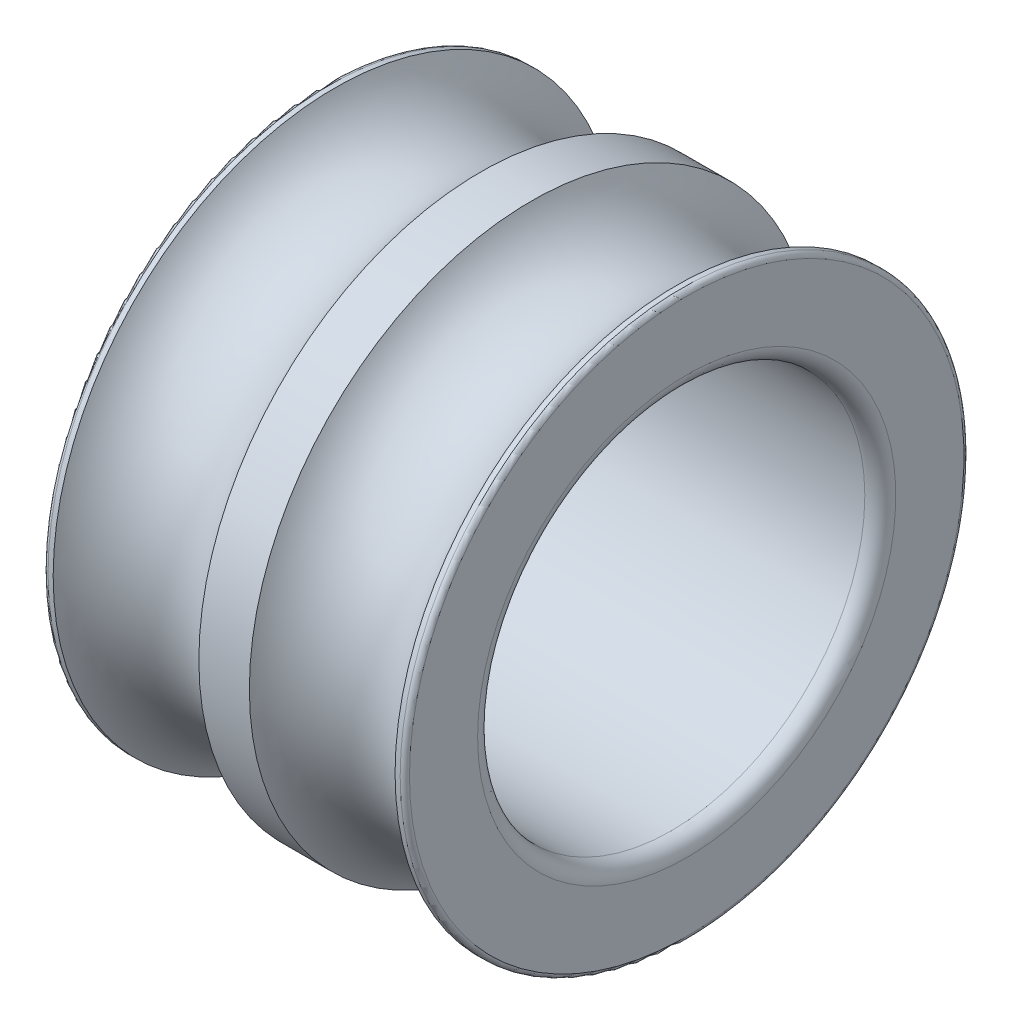
ISO-10303-21;
HEADER;
FILE_DESCRIPTION(('STEP AP214'),'2;1');
FILE_NAME('part.step','',(''),(''),'','','');
FILE_SCHEMA(('AUTOMOTIVE_DESIGN { 1 0 10303 214 1 1 1 1 }'));
ENDSEC;
DATA;
#1=APPLICATION_CONTEXT('core data for automotive mechanical design processes');
#2=APPLICATION_PROTOCOL_DEFINITION('international standard','automotive_design',2000,#1);
#3=PRODUCT_CONTEXT('',#1,'mechanical');
#4=PRODUCT('Part','Part','',(#3));
#5=PRODUCT_RELATED_PRODUCT_CATEGORY('part','',(#4));
#6=PRODUCT_DEFINITION_FORMATION('','',#4);
#7=PRODUCT_DEFINITION_CONTEXT('part definition',#1,'design');
#8=PRODUCT_DEFINITION('design','',#6,#7);
#9=PRODUCT_DEFINITION_SHAPE('','',#8);
#10=(LENGTH_UNIT() NAMED_UNIT(*) SI_UNIT(.MILLI.,.METRE.));
#11=(NAMED_UNIT(*) PLANE_ANGLE_UNIT() SI_UNIT($,.RADIAN.));
#12=(NAMED_UNIT(*) SI_UNIT($,.STERADIAN.) SOLID_ANGLE_UNIT());
#13=UNCERTAINTY_MEASURE_WITH_UNIT(LENGTH_MEASURE(1.E-05),#10,'distance_accuracy_value','');
#14=(GEOMETRIC_REPRESENTATION_CONTEXT(3) GLOBAL_UNCERTAINTY_ASSIGNED_CONTEXT((#13)) GLOBAL_UNIT_ASSIGNED_CONTEXT((#10,
#11,#12)) REPRESENTATION_CONTEXT('',''));
#15=CARTESIAN_POINT('',(0.,0.,0.));
#16=DIRECTION('',(0.,0.,1.));
#17=DIRECTION('',(1.,0.,0.));
#18=AXIS2_PLACEMENT_3D('',#15,#16,#17);
#19=CARTESIAN_POINT('',(0.,0.,0.));
#20=DIRECTION('',(-1.,0.,0.));
#21=DIRECTION('',(0.,0.,1.));
#22=AXIS2_PLACEMENT_3D('',#19,#20,#21);
#23=CYLINDRICAL_SURFACE('',#22,10.92);
#24=CARTESIAN_POINT('',(7.97826387261311,0.,0.));
#25=DIRECTION('',(-1.,0.,0.));
#26=DIRECTION('',(0.,0.,1.));
#27=AXIS2_PLACEMENT_3D('',#24,#25,#26);
#28=CIRCLE('',#27,10.92);
#29=CARTESIAN_POINT('',(7.97826387261311,0.,10.92));
#30=VERTEX_POINT('',#29);
#31=EDGE_CURVE('E71',#30,#30,#28,.T.);
#32=ORIENTED_EDGE('',*,*,#31,.T.);
#33=EDGE_LOOP('',(#32));
#34=FACE_BOUND('',#33,.T.);
#35=CARTESIAN_POINT('',(6.02173612738689,0.,0.));
#36=DIRECTION('',(-1.,0.,0.));
#37=DIRECTION('',(0.,0.,1.));
#38=AXIS2_PLACEMENT_3D('',#35,#36,#37);
#39=CIRCLE('',#38,10.92);
#40=CARTESIAN_POINT('',(6.02173612738689,0.,10.92));
#41=VERTEX_POINT('',#40);
#42=EDGE_CURVE('E10',#41,#41,#39,.T.);
#43=ORIENTED_EDGE('',*,*,#42,.F.);
#44=EDGE_LOOP('',(#43));
#45=FACE_BOUND('',#44,.T.);
#46=ADVANCED_FACE('F14',(#34,#45),#23,.T.);
#47=CARTESIAN_POINT('',(3.2,0.,0.));
#48=DIRECTION('',(-1.,0.,0.));
#49=DIRECTION('',(0.,0.,1.));
#50=AXIS2_PLACEMENT_3D('',#47,#48,#49);
#51=TOROIDAL_SURFACE('',#50,12.4292399502397,3.2);
#52=ORIENTED_EDGE('',*,*,#42,.T.);
#53=EDGE_LOOP('',(#52));
#54=FACE_BOUND('',#53,.T.);
#55=CARTESIAN_POINT('',(0.378263872613112,0.,0.));
#56=DIRECTION('',(-1.,0.,0.));
#57=DIRECTION('',(0.,0.,1.));
#58=AXIS2_PLACEMENT_3D('',#55,#56,#57);
#59=CIRCLE('',#58,10.92);
#60=CARTESIAN_POINT('',(0.378263872613112,0.,10.92));
#61=VERTEX_POINT('',#60);
#62=EDGE_CURVE('E21',#61,#61,#59,.T.);
#63=ORIENTED_EDGE('',*,*,#62,.F.);
#64=EDGE_LOOP('',(#63));
#65=FACE_BOUND('',#64,.T.);
#66=ADVANCED_FACE('F92',(#54,#65),#51,.F.);
#67=CARTESIAN_POINT('',(0.,0.,0.));
#68=DIRECTION('',(-1.,0.,0.));
#69=DIRECTION('',(0.,0.,1.));
#70=AXIS2_PLACEMENT_3D('',#67,#68,#69);
#71=CYLINDRICAL_SURFACE('',#70,10.92);
#72=ORIENTED_EDGE('',*,*,#62,.T.);
#73=EDGE_LOOP('',(#72));
#74=FACE_BOUND('',#73,.T.);
#75=CARTESIAN_POINT('',(0.18,0.,0.));
#76=DIRECTION('',(-1.,0.,0.));
#77=DIRECTION('',(0.,0.,1.));
#78=AXIS2_PLACEMENT_3D('',#75,#76,#77);
#79=CIRCLE('',#78,10.92);
#80=CARTESIAN_POINT('',(0.18,0.,10.92));
#81=VERTEX_POINT('',#80);
#82=EDGE_CURVE('E30',#81,#81,#79,.T.);
#83=ORIENTED_EDGE('',*,*,#82,.F.);
#84=EDGE_LOOP('',(#83));
#85=FACE_BOUND('',#84,.T.);
#86=ADVANCED_FACE('F96',(#74,#85),#71,.T.);
#87=CARTESIAN_POINT('',(0.18,0.,0.));
#88=DIRECTION('',(-1.,0.,0.));
#89=DIRECTION('',(0.,0.,1.));
#90=AXIS2_PLACEMENT_3D('',#87,#88,#89);
#91=TOROIDAL_SURFACE('',#90,10.74,0.18);
#92=CARTESIAN_POINT('',(0.,0.,0.));
#93=DIRECTION('',(-1.,0.,0.));
#94=DIRECTION('',(0.,0.,1.));
#95=AXIS2_PLACEMENT_3D('',#92,#93,#94);
#96=CIRCLE('',#95,10.74);
#97=CARTESIAN_POINT('',(0.,0.,10.74));
#98=VERTEX_POINT('',#97);
#99=EDGE_CURVE('E37',#98,#98,#96,.T.);
#100=ORIENTED_EDGE('',*,*,#99,.F.);
#101=EDGE_LOOP('',(#100));
#102=FACE_BOUND('',#101,.T.);
#103=ORIENTED_EDGE('',*,*,#82,.T.);
#104=EDGE_LOOP('',(#103));
#105=FACE_BOUND('',#104,.T.);
#106=ADVANCED_FACE('F100',(#102,#105),#91,.T.);
#107=CARTESIAN_POINT('',(0.,10.74,0.));
#108=DIRECTION('',(1.,0.,0.));
#109=DIRECTION('',(0.,0.,-1.));
#110=AXIS2_PLACEMENT_3D('',#107,#108,#109);
#111=PLANE('',#110);
#112=CARTESIAN_POINT('',(0.,0.,0.));
#113=DIRECTION('',(-1.,0.,0.));
#114=DIRECTION('',(0.,0.,1.));
#115=AXIS2_PLACEMENT_3D('',#112,#113,#114);
#116=CIRCLE('',#115,8.1);
#117=CARTESIAN_POINT('',(0.,0.,8.1));
#118=VERTEX_POINT('',#117);
#119=EDGE_CURVE('E43',#118,#118,#116,.T.);
#120=ORIENTED_EDGE('',*,*,#119,.F.);
#121=EDGE_LOOP('',(#120));
#122=FACE_BOUND('',#121,.T.);
#123=ORIENTED_EDGE('',*,*,#99,.T.);
#124=EDGE_LOOP('',(#123));
#125=FACE_BOUND('',#124,.T.);
#126=ADVANCED_FACE('F106',(#122,#125),#111,.F.);
#127=CARTESIAN_POINT('',(0.6,0.,0.));
#128=DIRECTION('',(-1.,0.,0.));
#129=DIRECTION('',(0.,0.,1.));
#130=AXIS2_PLACEMENT_3D('',#127,#128,#129);
#131=TOROIDAL_SURFACE('',#130,8.1,0.6);
#132=CARTESIAN_POINT('',(0.6,0.,0.));
#133=DIRECTION('',(-1.,0.,0.));
#134=DIRECTION('',(0.,0.,1.));
#135=AXIS2_PLACEMENT_3D('',#132,#133,#134);
#136=CIRCLE('',#135,7.5);
#137=CARTESIAN_POINT('',(0.6,0.,7.5));
#138=VERTEX_POINT('',#137);
#139=EDGE_CURVE('E47',#138,#138,#136,.T.);
#140=ORIENTED_EDGE('',*,*,#139,.F.);
#141=EDGE_LOOP('',(#140));
#142=FACE_BOUND('',#141,.T.);
#143=ORIENTED_EDGE('',*,*,#119,.T.);
#144=EDGE_LOOP('',(#143));
#145=FACE_BOUND('',#144,.T.);
#146=ADVANCED_FACE('F110',(#142,#145),#131,.T.);
#147=CARTESIAN_POINT('',(0.,0.,0.));
#148=DIRECTION('',(-1.,0.,0.));
#149=DIRECTION('',(0.,0.,1.));
#150=AXIS2_PLACEMENT_3D('',#147,#148,#149);
#151=CYLINDRICAL_SURFACE('',#150,7.5);
#152=CARTESIAN_POINT('',(13.4,0.,0.));
#153=DIRECTION('',(-1.,0.,0.));
#154=DIRECTION('',(0.,0.,1.));
#155=AXIS2_PLACEMENT_3D('',#152,#153,#154);
#156=CIRCLE('',#155,7.5);
#157=CARTESIAN_POINT('',(13.4,0.,7.5));
#158=VERTEX_POINT('',#157);
#159=EDGE_CURVE('E51',#158,#158,#156,.T.);
#160=ORIENTED_EDGE('',*,*,#159,.F.);
#161=EDGE_LOOP('',(#160));
#162=FACE_BOUND('',#161,.T.);
#163=ORIENTED_EDGE('',*,*,#139,.T.);
#164=EDGE_LOOP('',(#163));
#165=FACE_BOUND('',#164,.T.);
#166=ADVANCED_FACE('F114',(#162,#165),#151,.F.);
#167=CARTESIAN_POINT('',(13.4,0.,0.));
#168=DIRECTION('',(-1.,0.,0.));
#169=DIRECTION('',(0.,0.,1.));
#170=AXIS2_PLACEMENT_3D('',#167,#168,#169);
#171=TOROIDAL_SURFACE('',#170,8.1,0.6);
#172=CARTESIAN_POINT('',(14.,0.,0.));
#173=DIRECTION('',(-1.,0.,0.));
#174=DIRECTION('',(0.,0.,1.));
#175=AXIS2_PLACEMENT_3D('',#172,#173,#174);
#176=CIRCLE('',#175,8.1);
#177=CARTESIAN_POINT('',(14.,0.,8.1));
#178=VERTEX_POINT('',#177);
#179=EDGE_CURVE('E55',#178,#178,#176,.T.);
#180=ORIENTED_EDGE('',*,*,#179,.F.);
#181=EDGE_LOOP('',(#180));
#182=FACE_BOUND('',#181,.T.);
#183=ORIENTED_EDGE('',*,*,#159,.T.);
#184=EDGE_LOOP('',(#183));
#185=FACE_BOUND('',#184,.T.);
#186=ADVANCED_FACE('F118',(#182,#185),#171,.T.);
#187=CARTESIAN_POINT('',(14.,8.1,0.));
#188=DIRECTION('',(-1.,0.,0.));
#189=DIRECTION('',(0.,0.,1.));
#190=AXIS2_PLACEMENT_3D('',#187,#188,#189);
#191=PLANE('',#190);
#192=CARTESIAN_POINT('',(14.,0.,0.));
#193=DIRECTION('',(-1.,0.,0.));
#194=DIRECTION('',(0.,0.,1.));
#195=AXIS2_PLACEMENT_3D('',#192,#193,#194);
#196=CIRCLE('',#195,10.74);
#197=CARTESIAN_POINT('',(14.,0.,10.74));
#198=VERTEX_POINT('',#197);
#199=EDGE_CURVE('E59',#198,#198,#196,.T.);
#200=ORIENTED_EDGE('',*,*,#199,.F.);
#201=EDGE_LOOP('',(#200));
#202=FACE_BOUND('',#201,.T.);
#203=ORIENTED_EDGE('',*,*,#179,.T.);
#204=EDGE_LOOP('',(#203));
#205=FACE_BOUND('',#204,.T.);
#206=ADVANCED_FACE('F122',(#202,#205),#191,.F.);
#207=CARTESIAN_POINT('',(13.82,0.,0.));
#208=DIRECTION('',(-1.,0.,0.));
#209=DIRECTION('',(0.,0.,1.));
#210=AXIS2_PLACEMENT_3D('',#207,#208,#209);
#211=TOROIDAL_SURFACE('',#210,10.74,0.18);
#212=CARTESIAN_POINT('',(13.82,0.,0.));
#213=DIRECTION('',(-1.,0.,0.));
#214=DIRECTION('',(0.,0.,1.));
#215=AXIS2_PLACEMENT_3D('',#212,#213,#214);
#216=CIRCLE('',#215,10.92);
#217=CARTESIAN_POINT('',(13.82,0.,10.92));
#218=VERTEX_POINT('',#217);
#219=EDGE_CURVE('E63',#218,#218,#216,.T.);
#220=ORIENTED_EDGE('',*,*,#219,.F.);
#221=EDGE_LOOP('',(#220));
#222=FACE_BOUND('',#221,.T.);
#223=ORIENTED_EDGE('',*,*,#199,.T.);
#224=EDGE_LOOP('',(#223));
#225=FACE_BOUND('',#224,.T.);
#226=ADVANCED_FACE('F88',(#222,#225),#211,.T.);
#227=CARTESIAN_POINT('',(0.,0.,0.));
#228=DIRECTION('',(-1.,0.,0.));
#229=DIRECTION('',(0.,0.,1.));
#230=AXIS2_PLACEMENT_3D('',#227,#228,#229);
#231=CYLINDRICAL_SURFACE('',#230,10.92);
#232=ORIENTED_EDGE('',*,*,#219,.T.);
#233=EDGE_LOOP('',(#232));
#234=FACE_BOUND('',#233,.T.);
#235=CARTESIAN_POINT('',(13.6217361273869,0.,0.));
#236=DIRECTION('',(-1.,0.,0.));
#237=DIRECTION('',(0.,0.,1.));
#238=AXIS2_PLACEMENT_3D('',#235,#236,#237);
#239=CIRCLE('',#238,10.92);
#240=CARTESIAN_POINT('',(13.6217361273869,0.,10.92));
#241=VERTEX_POINT('',#240);
#242=EDGE_CURVE('E67',#241,#241,#239,.T.);
#243=ORIENTED_EDGE('',*,*,#242,.F.);
#244=EDGE_LOOP('',(#243));
#245=FACE_BOUND('',#244,.T.);
#246=ADVANCED_FACE('F81',(#234,#245),#231,.T.);
#247=CARTESIAN_POINT('',(10.8,0.,0.));
#248=DIRECTION('',(-1.,0.,0.));
#249=DIRECTION('',(0.,0.,1.));
#250=AXIS2_PLACEMENT_3D('',#247,#248,#249);
#251=TOROIDAL_SURFACE('',#250,12.4292399502397,3.2);
#252=ORIENTED_EDGE('',*,*,#242,.T.);
#253=EDGE_LOOP('',(#252));
#254=FACE_BOUND('',#253,.T.);
#255=ORIENTED_EDGE('',*,*,#31,.F.);
#256=EDGE_LOOP('',(#255));
#257=FACE_BOUND('',#256,.T.);
#258=ADVANCED_FACE('F79',(#254,#257),#251,.F.);
#259=CLOSED_SHELL('',(#46,#66,#86,#106,#126,#146,#166,#186,#206,#226,#246,#258));
#260=MANIFOLD_SOLID_BREP('B1',#259);
#261=ADVANCED_BREP_SHAPE_REPRESENTATION('',(#18,#260),#14);
#262=SHAPE_DEFINITION_REPRESENTATION(#9,#261);
ENDSEC;
END-ISO-10303-21;
